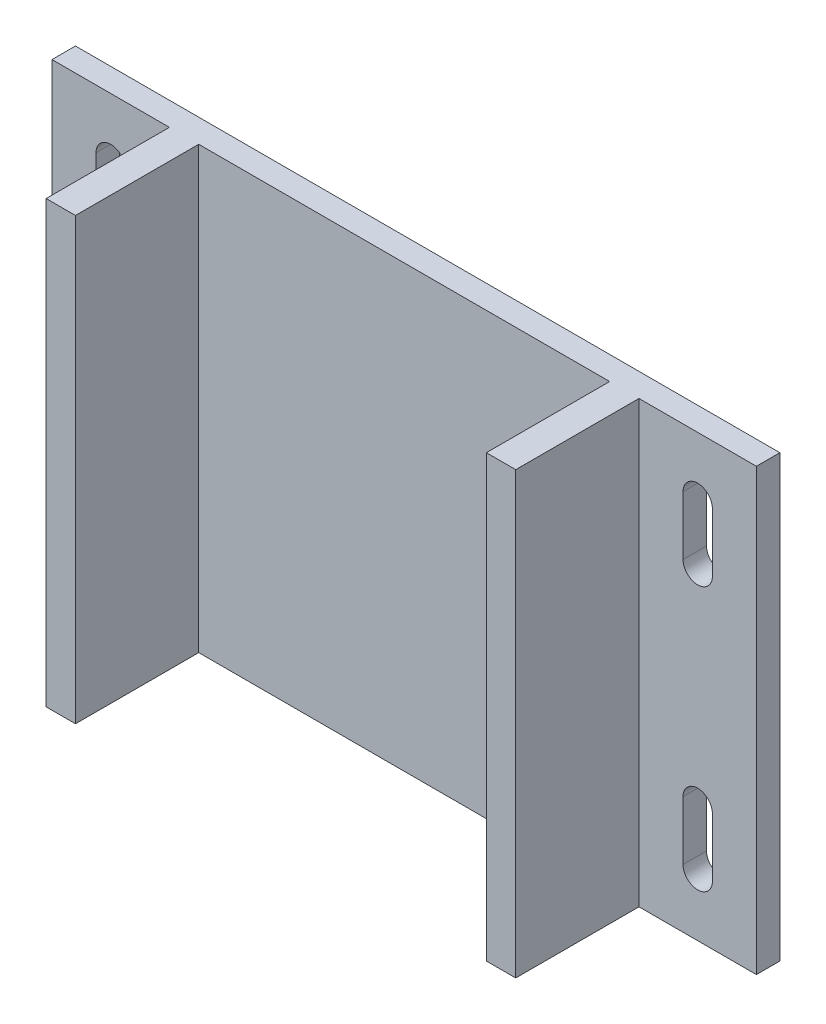
ISO-10303-21;
HEADER;
FILE_DESCRIPTION(('STEP AP214'),'2;1');
FILE_NAME('part.step','',(''),(''),'','','');
FILE_SCHEMA(('AUTOMOTIVE_DESIGN { 1 0 10303 214 1 1 1 1 }'));
ENDSEC;
DATA;
#1=APPLICATION_CONTEXT('core data for automotive mechanical design processes');
#2=APPLICATION_PROTOCOL_DEFINITION('international standard','automotive_design',2000,#1);
#3=PRODUCT_CONTEXT('',#1,'mechanical');
#4=PRODUCT('Part','Part','',(#3));
#5=PRODUCT_RELATED_PRODUCT_CATEGORY('part','',(#4));
#6=PRODUCT_DEFINITION_FORMATION('','',#4);
#7=PRODUCT_DEFINITION_CONTEXT('part definition',#1,'design');
#8=PRODUCT_DEFINITION('design','',#6,#7);
#9=PRODUCT_DEFINITION_SHAPE('','',#8);
#10=(LENGTH_UNIT() NAMED_UNIT(*) SI_UNIT(.MILLI.,.METRE.));
#11=(NAMED_UNIT(*) PLANE_ANGLE_UNIT() SI_UNIT($,.RADIAN.));
#12=(NAMED_UNIT(*) SI_UNIT($,.STERADIAN.) SOLID_ANGLE_UNIT());
#13=UNCERTAINTY_MEASURE_WITH_UNIT(LENGTH_MEASURE(1.E-05),#10,'distance_accuracy_value','');
#14=(GEOMETRIC_REPRESENTATION_CONTEXT(3) GLOBAL_UNCERTAINTY_ASSIGNED_CONTEXT((#13)) GLOBAL_UNIT_ASSIGNED_CONTEXT((#10,
#11,#12)) REPRESENTATION_CONTEXT('',''));
#15=CARTESIAN_POINT('',(0.,0.,0.));
#16=DIRECTION('',(0.,0.,1.));
#17=DIRECTION('',(1.,0.,0.));
#18=AXIS2_PLACEMENT_3D('',#15,#16,#17);
#19=CARTESIAN_POINT('',(0.,0.,4.));
#20=DIRECTION('',(0.,0.,-1.));
#21=DIRECTION('',(-1.,0.,0.));
#22=AXIS2_PLACEMENT_3D('',#19,#20,#21);
#23=PLANE('',#22);
#24=DIRECTION('',(0.,-1.,0.));
#25=VECTOR('',#24,1.);
#26=CARTESIAN_POINT('',(95.,0.,4.));
#27=LINE('',#26,#25);
#28=CARTESIAN_POINT('',(95.,75.,4.));
#29=VERTEX_POINT('',#28);
#30=CARTESIAN_POINT('',(95.,0.,4.));
#31=VERTEX_POINT('',#30);
#32=EDGE_CURVE('E356',#29,#31,#27,.T.);
#33=ORIENTED_EDGE('',*,*,#32,.F.);
#34=DIRECTION('',(-1.,0.,0.));
#35=VECTOR('',#34,1.);
#36=CARTESIAN_POINT('',(0.,75.,4.));
#37=LINE('',#36,#35);
#38=CARTESIAN_POINT('',(25.,75.,4.));
#39=VERTEX_POINT('',#38);
#40=EDGE_CURVE('E409',#29,#39,#37,.T.);
#41=ORIENTED_EDGE('',*,*,#40,.T.);
#42=DIRECTION('',(0.,1.,0.));
#43=VECTOR('',#42,1.);
#44=CARTESIAN_POINT('',(25.,0.,4.));
#45=LINE('',#44,#43);
#46=CARTESIAN_POINT('',(25.,0.,4.));
#47=VERTEX_POINT('',#46);
#48=EDGE_CURVE('E388',#47,#39,#45,.T.);
#49=ORIENTED_EDGE('',*,*,#48,.F.);
#50=DIRECTION('',(1.,0.,0.));
#51=VECTOR('',#50,1.);
#52=CARTESIAN_POINT('',(0.,0.,4.));
#53=LINE('',#52,#51);
#54=EDGE_CURVE('E426',#47,#31,#53,.T.);
#55=ORIENTED_EDGE('',*,*,#54,.T.);
#56=EDGE_LOOP('',(#33,#41,#49,#55));
#57=FACE_BOUND('',#56,.T.);
#58=ADVANCED_FACE('F35',(#57),#23,.F.);
#59=DIRECTION('',(0.,1.,0.));
#60=VECTOR('',#59,1.);
#61=CARTESIAN_POINT('',(107.5,1.49186218934005E-13,4.));
#62=LINE('',#61,#60);
#63=CARTESIAN_POINT('',(107.5,10.,4.));
#64=VERTEX_POINT('',#63);
#65=CARTESIAN_POINT('',(107.5,20.,4.));
#66=VERTEX_POINT('',#65);
#67=EDGE_CURVE('E318',#64,#66,#62,.T.);
#68=ORIENTED_EDGE('',*,*,#67,.T.);
#69=CARTESIAN_POINT('',(110.,20.,4.));
#70=DIRECTION('',(0.,0.,-1.));
#71=DIRECTION('',(-1.,0.,0.));
#72=AXIS2_PLACEMENT_3D('',#69,#70,#71);
#73=CIRCLE('',#72,2.50000000000001);
#74=CARTESIAN_POINT('',(112.5,20.,4.));
#75=VERTEX_POINT('',#74);
#76=EDGE_CURVE('E321',#66,#75,#73,.T.);
#77=ORIENTED_EDGE('',*,*,#76,.T.);
#78=DIRECTION('',(0.,-1.,0.));
#79=VECTOR('',#78,1.);
#80=CARTESIAN_POINT('',(112.5,0.,4.));
#81=LINE('',#80,#79);
#82=CARTESIAN_POINT('',(112.5,9.99999999999999,4.));
#83=VERTEX_POINT('',#82);
#84=EDGE_CURVE('E306',#75,#83,#81,.T.);
#85=ORIENTED_EDGE('',*,*,#84,.T.);
#86=CARTESIAN_POINT('',(110.,9.99999999999999,4.));
#87=DIRECTION('',(0.,0.,-1.));
#88=DIRECTION('',(-1.,0.,0.));
#89=AXIS2_PLACEMENT_3D('',#86,#87,#88);
#90=CIRCLE('',#89,2.5);
#91=EDGE_CURVE('E315',#83,#64,#90,.T.);
#92=ORIENTED_EDGE('',*,*,#91,.T.);
#93=EDGE_LOOP('',(#68,#77,#85,#92));
#94=FACE_BOUND('',#93,.T.);
#95=DIRECTION('',(0.,1.,0.));
#96=VECTOR('',#95,1.);
#97=CARTESIAN_POINT('',(107.5,-1.49186218934005E-13,4.));
#98=LINE('',#97,#96);
#99=CARTESIAN_POINT('',(107.5,55.,4.));
#100=VERTEX_POINT('',#99);
#101=CARTESIAN_POINT('',(107.5,65.,4.));
#102=VERTEX_POINT('',#101);
#103=EDGE_CURVE('E350',#100,#102,#98,.T.);
#104=ORIENTED_EDGE('',*,*,#103,.T.);
#105=CARTESIAN_POINT('',(110.,65.,4.));
#106=DIRECTION('',(0.,0.,-1.));
#107=DIRECTION('',(-1.,0.,0.));
#108=AXIS2_PLACEMENT_3D('',#105,#106,#107);
#109=CIRCLE('',#108,2.5);
#110=CARTESIAN_POINT('',(112.5,65.,4.));
#111=VERTEX_POINT('',#110);
#112=EDGE_CURVE('E353',#102,#111,#109,.T.);
#113=ORIENTED_EDGE('',*,*,#112,.T.);
#114=DIRECTION('',(0.,-1.,0.));
#115=VECTOR('',#114,1.);
#116=CARTESIAN_POINT('',(112.5,0.,4.));
#117=LINE('',#116,#115);
#118=CARTESIAN_POINT('',(112.5,55.,4.));
#119=VERTEX_POINT('',#118);
#120=EDGE_CURVE('E338',#111,#119,#117,.T.);
#121=ORIENTED_EDGE('',*,*,#120,.T.);
#122=CARTESIAN_POINT('',(110.,55.,4.));
#123=DIRECTION('',(0.,0.,-1.));
#124=DIRECTION('',(-1.,0.,0.));
#125=AXIS2_PLACEMENT_3D('',#122,#123,#124);
#126=CIRCLE('',#125,2.50000000000001);
#127=EDGE_CURVE('E347',#119,#100,#126,.T.);
#128=ORIENTED_EDGE('',*,*,#127,.T.);
#129=EDGE_LOOP('',(#104,#113,#121,#128));
#130=FACE_BOUND('',#129,.T.);
#131=DIRECTION('',(0.,1.,0.));
#132=VECTOR('',#131,1.);
#133=CARTESIAN_POINT('',(100.,0.,4.));
#134=LINE('',#133,#132);
#135=CARTESIAN_POINT('',(100.,0.,4.));
#136=VERTEX_POINT('',#135);
#137=CARTESIAN_POINT('',(100.,75.,4.));
#138=VERTEX_POINT('',#137);
#139=EDGE_CURVE('E361',#136,#138,#134,.T.);
#140=ORIENTED_EDGE('',*,*,#139,.F.);
#141=CARTESIAN_POINT('',(120.,0.,4.));
#142=VERTEX_POINT('',#141);
#143=EDGE_CURVE('E39',#136,#142,#53,.T.);
#144=ORIENTED_EDGE('',*,*,#143,.T.);
#145=DIRECTION('',(0.,1.,0.));
#146=VECTOR('',#145,1.);
#147=CARTESIAN_POINT('',(120.,0.,4.));
#148=LINE('',#147,#146);
#149=CARTESIAN_POINT('',(120.,75.,4.));
#150=VERTEX_POINT('',#149);
#151=EDGE_CURVE('E416',#142,#150,#148,.T.);
#152=ORIENTED_EDGE('',*,*,#151,.T.);
#153=EDGE_CURVE('E411',#150,#138,#37,.T.);
#154=ORIENTED_EDGE('',*,*,#153,.T.);
#155=EDGE_LOOP('',(#140,#144,#152,#154));
#156=FACE_BOUND('',#155,.T.);
#157=ADVANCED_FACE('F508',(#94,#130,#156),#23,.F.);
#158=DIRECTION('',(0.,-1.,0.));
#159=VECTOR('',#158,1.);
#160=CARTESIAN_POINT('',(12.5000000000001,0.,4.));
#161=LINE('',#160,#159);
#162=CARTESIAN_POINT('',(12.5,65.,4.));
#163=VERTEX_POINT('',#162);
#164=CARTESIAN_POINT('',(12.5,55.,4.));
#165=VERTEX_POINT('',#164);
#166=EDGE_CURVE('E254',#163,#165,#161,.T.);
#167=ORIENTED_EDGE('',*,*,#166,.T.);
#168=CARTESIAN_POINT('',(10.,55.,4.));
#169=DIRECTION('',(0.,0.,-1.));
#170=DIRECTION('',(-1.,0.,0.));
#171=AXIS2_PLACEMENT_3D('',#168,#169,#170);
#172=CIRCLE('',#171,2.50000000000001);
#173=CARTESIAN_POINT('',(7.50000000000002,55.,4.));
#174=VERTEX_POINT('',#173);
#175=EDGE_CURVE('E257',#165,#174,#172,.T.);
#176=ORIENTED_EDGE('',*,*,#175,.T.);
#177=DIRECTION('',(0.,1.,0.));
#178=VECTOR('',#177,1.);
#179=CARTESIAN_POINT('',(7.50000000000002,0.,4.));
#180=LINE('',#179,#178);
#181=CARTESIAN_POINT('',(7.50000000000002,65.,4.));
#182=VERTEX_POINT('',#181);
#183=EDGE_CURVE('E249',#174,#182,#180,.T.);
#184=ORIENTED_EDGE('',*,*,#183,.T.);
#185=CARTESIAN_POINT('',(10.,65.,4.));
#186=DIRECTION('',(0.,0.,-1.));
#187=DIRECTION('',(-1.,0.,0.));
#188=AXIS2_PLACEMENT_3D('',#185,#186,#187);
#189=CIRCLE('',#188,2.5);
#190=EDGE_CURVE('E229',#182,#163,#189,.T.);
#191=ORIENTED_EDGE('',*,*,#190,.T.);
#192=EDGE_LOOP('',(#167,#176,#184,#191));
#193=FACE_BOUND('',#192,.T.);
#194=DIRECTION('',(0.,-1.,0.));
#195=VECTOR('',#194,1.);
#196=CARTESIAN_POINT('',(12.5,0.,4.));
#197=LINE('',#196,#195);
#198=CARTESIAN_POINT('',(12.5,20.,4.));
#199=VERTEX_POINT('',#198);
#200=CARTESIAN_POINT('',(12.5,10.,4.));
#201=VERTEX_POINT('',#200);
#202=EDGE_CURVE('E286',#199,#201,#197,.T.);
#203=ORIENTED_EDGE('',*,*,#202,.T.);
#204=CARTESIAN_POINT('',(10.,9.99999999999999,4.));
#205=DIRECTION('',(0.,0.,-1.));
#206=DIRECTION('',(-1.,0.,0.));
#207=AXIS2_PLACEMENT_3D('',#204,#205,#206);
#208=CIRCLE('',#207,2.5);
#209=CARTESIAN_POINT('',(7.50000000000001,9.99999999999999,4.));
#210=VERTEX_POINT('',#209);
#211=EDGE_CURVE('E289',#201,#210,#208,.T.);
#212=ORIENTED_EDGE('',*,*,#211,.T.);
#213=DIRECTION('',(0.,1.,0.));
#214=VECTOR('',#213,1.);
#215=CARTESIAN_POINT('',(7.50000000000001,0.,4.));
#216=LINE('',#215,#214);
#217=CARTESIAN_POINT('',(7.50000000000001,20.,4.));
#218=VERTEX_POINT('',#217);
#219=EDGE_CURVE('E274',#210,#218,#216,.T.);
#220=ORIENTED_EDGE('',*,*,#219,.T.);
#221=CARTESIAN_POINT('',(10.,20.,4.));
#222=DIRECTION('',(0.,0.,-1.));
#223=DIRECTION('',(-1.,0.,0.));
#224=AXIS2_PLACEMENT_3D('',#221,#222,#223);
#225=CIRCLE('',#224,2.50000000000001);
#226=EDGE_CURVE('E283',#218,#199,#225,.T.);
#227=ORIENTED_EDGE('',*,*,#226,.T.);
#228=EDGE_LOOP('',(#203,#212,#220,#227));
#229=FACE_BOUND('',#228,.T.);
#230=DIRECTION('',(0.,-1.,0.));
#231=VECTOR('',#230,1.);
#232=CARTESIAN_POINT('',(20.,0.,4.));
#233=LINE('',#232,#231);
#234=CARTESIAN_POINT('',(20.,75.,4.));
#235=VERTEX_POINT('',#234);
#236=CARTESIAN_POINT('',(20.,0.,4.));
#237=VERTEX_POINT('',#236);
#238=EDGE_CURVE('E383',#235,#237,#233,.T.);
#239=ORIENTED_EDGE('',*,*,#238,.F.);
#240=CARTESIAN_POINT('',(0.,75.,4.));
#241=VERTEX_POINT('',#240);
#242=EDGE_CURVE('E412',#235,#241,#37,.T.);
#243=ORIENTED_EDGE('',*,*,#242,.T.);
#244=DIRECTION('',(0.,-1.,0.));
#245=VECTOR('',#244,1.);
#246=CARTESIAN_POINT('',(0.,0.,4.));
#247=LINE('',#246,#245);
#248=CARTESIAN_POINT('',(0.,0.,4.));
#249=VERTEX_POINT('',#248);
#250=EDGE_CURVE('E430',#241,#249,#247,.T.);
#251=ORIENTED_EDGE('',*,*,#250,.T.);
#252=EDGE_CURVE('E428',#249,#237,#53,.T.);
#253=ORIENTED_EDGE('',*,*,#252,.T.);
#254=EDGE_LOOP('',(#239,#243,#251,#253));
#255=FACE_BOUND('',#254,.T.);
#256=ADVANCED_FACE('F509',(#193,#229,#255),#23,.F.);
#257=CARTESIAN_POINT('',(0.,0.,4.));
#258=DIRECTION('',(1.,0.,0.));
#259=DIRECTION('',(0.,0.,-1.));
#260=AXIS2_PLACEMENT_3D('',#257,#258,#259);
#261=PLANE('',#260);
#262=DIRECTION('',(0.,-1.,0.));
#263=VECTOR('',#262,1.);
#264=CARTESIAN_POINT('',(0.,0.,0.));
#265=LINE('',#264,#263);
#266=CARTESIAN_POINT('',(0.,75.,0.));
#267=VERTEX_POINT('',#266);
#268=CARTESIAN_POINT('',(0.,0.,0.));
#269=VERTEX_POINT('',#268);
#270=EDGE_CURVE('E417',#267,#269,#265,.T.);
#271=ORIENTED_EDGE('',*,*,#270,.T.);
#272=DIRECTION('',(0.,0.,-1.));
#273=VECTOR('',#272,1.);
#274=CARTESIAN_POINT('',(0.,0.,4.));
#275=LINE('',#274,#273);
#276=EDGE_CURVE('E11',#249,#269,#275,.T.);
#277=ORIENTED_EDGE('',*,*,#276,.F.);
#278=ORIENTED_EDGE('',*,*,#250,.F.);
#279=DIRECTION('',(0.,0.,-1.));
#280=VECTOR('',#279,1.);
#281=CARTESIAN_POINT('',(0.,75.,4.));
#282=LINE('',#281,#280);
#283=EDGE_CURVE('E425',#241,#267,#282,.T.);
#284=ORIENTED_EDGE('',*,*,#283,.T.);
#285=EDGE_LOOP('',(#271,#277,#278,#284));
#286=FACE_BOUND('',#285,.T.);
#287=ADVANCED_FACE('F37',(#286),#261,.F.);
#288=CARTESIAN_POINT('',(0.,0.,4.));
#289=DIRECTION('',(0.,1.,0.));
#290=DIRECTION('',(0.,0.,1.));
#291=AXIS2_PLACEMENT_3D('',#288,#289,#290);
#292=PLANE('',#291);
#293=DIRECTION('',(1.,0.,0.));
#294=VECTOR('',#293,1.);
#295=CARTESIAN_POINT('',(0.,0.,0.));
#296=LINE('',#295,#294);
#297=CARTESIAN_POINT('',(120.,0.,0.));
#298=VERTEX_POINT('',#297);
#299=EDGE_CURVE('E445',#269,#298,#296,.T.);
#300=ORIENTED_EDGE('',*,*,#299,.T.);
#301=DIRECTION('',(0.,0.,-1.));
#302=VECTOR('',#301,1.);
#303=CARTESIAN_POINT('',(120.,0.,4.));
#304=LINE('',#303,#302);
#305=EDGE_CURVE('E45',#142,#298,#304,.T.);
#306=ORIENTED_EDGE('',*,*,#305,.F.);
#307=ORIENTED_EDGE('',*,*,#143,.F.);
#308=DIRECTION('',(0.,0.,-1.));
#309=VECTOR('',#308,1.);
#310=CARTESIAN_POINT('',(100.,0.,25.));
#311=LINE('',#310,#309);
#312=CARTESIAN_POINT('',(100.,0.,25.));
#313=VERTEX_POINT('',#312);
#314=EDGE_CURVE('E377',#313,#136,#311,.T.);
#315=ORIENTED_EDGE('',*,*,#314,.F.);
#316=DIRECTION('',(1.,0.,0.));
#317=VECTOR('',#316,1.);
#318=CARTESIAN_POINT('',(95.,0.,25.));
#319=LINE('',#318,#317);
#320=CARTESIAN_POINT('',(95.,0.,25.));
#321=VERTEX_POINT('',#320);
#322=EDGE_CURVE('E360',#321,#313,#319,.T.);
#323=ORIENTED_EDGE('',*,*,#322,.F.);
#324=DIRECTION('',(0.,0.,-1.));
#325=VECTOR('',#324,1.);
#326=CARTESIAN_POINT('',(95.,0.,25.));
#327=LINE('',#326,#325);
#328=EDGE_CURVE('E380',#321,#31,#327,.T.);
#329=ORIENTED_EDGE('',*,*,#328,.T.);
#330=ORIENTED_EDGE('',*,*,#54,.F.);
#331=DIRECTION('',(0.,0.,-1.));
#332=VECTOR('',#331,1.);
#333=CARTESIAN_POINT('',(25.,0.,25.));
#334=LINE('',#333,#332);
#335=CARTESIAN_POINT('',(25.,0.,25.));
#336=VERTEX_POINT('',#335);
#337=EDGE_CURVE('E466',#336,#47,#334,.T.);
#338=ORIENTED_EDGE('',*,*,#337,.F.);
#339=DIRECTION('',(1.,0.,0.));
#340=VECTOR('',#339,1.);
#341=CARTESIAN_POINT('',(20.,0.,25.));
#342=LINE('',#341,#340);
#343=CARTESIAN_POINT('',(20.,0.,25.));
#344=VERTEX_POINT('',#343);
#345=EDGE_CURVE('E387',#344,#336,#342,.T.);
#346=ORIENTED_EDGE('',*,*,#345,.F.);
#347=DIRECTION('',(0.,0.,-1.));
#348=VECTOR('',#347,1.);
#349=CARTESIAN_POINT('',(20.,0.,25.));
#350=LINE('',#349,#348);
#351=EDGE_CURVE('E464',#344,#237,#350,.T.);
#352=ORIENTED_EDGE('',*,*,#351,.T.);
#353=ORIENTED_EDGE('',*,*,#252,.F.);
#354=ORIENTED_EDGE('',*,*,#276,.T.);
#355=EDGE_LOOP('',(#300,#306,#307,#315,#323,#329,#330,#338,#346,#352,#353,#354));
#356=FACE_BOUND('',#355,.T.);
#357=ADVANCED_FACE('F493',(#356),#292,.F.);
#358=CARTESIAN_POINT('',(120.,0.,4.));
#359=DIRECTION('',(-1.,0.,0.));
#360=DIRECTION('',(0.,0.,1.));
#361=AXIS2_PLACEMENT_3D('',#358,#359,#360);
#362=PLANE('',#361);
#363=DIRECTION('',(0.,1.,0.));
#364=VECTOR('',#363,1.);
#365=CARTESIAN_POINT('',(120.,0.,0.));
#366=LINE('',#365,#364);
#367=CARTESIAN_POINT('',(120.,75.,0.));
#368=VERTEX_POINT('',#367);
#369=EDGE_CURVE('E438',#298,#368,#366,.T.);
#370=ORIENTED_EDGE('',*,*,#369,.T.);
#371=DIRECTION('',(0.,0.,-1.));
#372=VECTOR('',#371,1.);
#373=CARTESIAN_POINT('',(120.,75.,4.));
#374=LINE('',#373,#372);
#375=EDGE_CURVE('E449',#150,#368,#374,.T.);
#376=ORIENTED_EDGE('',*,*,#375,.F.);
#377=ORIENTED_EDGE('',*,*,#151,.F.);
#378=ORIENTED_EDGE('',*,*,#305,.T.);
#379=EDGE_LOOP('',(#370,#376,#377,#378));
#380=FACE_BOUND('',#379,.T.);
#381=ADVANCED_FACE('F456',(#380),#362,.F.);
#382=CARTESIAN_POINT('',(0.,75.,4.));
#383=DIRECTION('',(0.,-1.,0.));
#384=DIRECTION('',(0.,0.,-1.));
#385=AXIS2_PLACEMENT_3D('',#382,#383,#384);
#386=PLANE('',#385);
#387=DIRECTION('',(-1.,0.,0.));
#388=VECTOR('',#387,1.);
#389=CARTESIAN_POINT('',(0.,75.,0.));
#390=LINE('',#389,#388);
#391=EDGE_CURVE('E434',#368,#267,#390,.T.);
#392=ORIENTED_EDGE('',*,*,#391,.T.);
#393=ORIENTED_EDGE('',*,*,#283,.F.);
#394=ORIENTED_EDGE('',*,*,#242,.F.);
#395=DIRECTION('',(0.,0.,-1.));
#396=VECTOR('',#395,1.);
#397=CARTESIAN_POINT('',(20.,75.,25.));
#398=LINE('',#397,#396);
#399=CARTESIAN_POINT('',(20.,75.,25.));
#400=VERTEX_POINT('',#399);
#401=EDGE_CURVE('E394',#400,#235,#398,.T.);
#402=ORIENTED_EDGE('',*,*,#401,.F.);
#403=DIRECTION('',(-1.,0.,0.));
#404=VECTOR('',#403,1.);
#405=CARTESIAN_POINT('',(20.,75.,25.));
#406=LINE('',#405,#404);
#407=CARTESIAN_POINT('',(25.,75.,25.));
#408=VERTEX_POINT('',#407);
#409=EDGE_CURVE('E392',#408,#400,#406,.T.);
#410=ORIENTED_EDGE('',*,*,#409,.F.);
#411=DIRECTION('',(0.,0.,-1.));
#412=VECTOR('',#411,1.);
#413=CARTESIAN_POINT('',(25.,75.,25.));
#414=LINE('',#413,#412);
#415=EDGE_CURVE('E407',#408,#39,#414,.T.);
#416=ORIENTED_EDGE('',*,*,#415,.T.);
#417=ORIENTED_EDGE('',*,*,#40,.F.);
#418=DIRECTION('',(0.,0.,-1.));
#419=VECTOR('',#418,1.);
#420=CARTESIAN_POINT('',(95.,75.,25.));
#421=LINE('',#420,#419);
#422=CARTESIAN_POINT('',(95.,75.,25.));
#423=VERTEX_POINT('',#422);
#424=EDGE_CURVE('E367',#423,#29,#421,.T.);
#425=ORIENTED_EDGE('',*,*,#424,.F.);
#426=DIRECTION('',(-1.,0.,0.));
#427=VECTOR('',#426,1.);
#428=CARTESIAN_POINT('',(95.,75.,25.));
#429=LINE('',#428,#427);
#430=CARTESIAN_POINT('',(100.,75.,25.));
#431=VERTEX_POINT('',#430);
#432=EDGE_CURVE('E365',#431,#423,#429,.T.);
#433=ORIENTED_EDGE('',*,*,#432,.F.);
#434=DIRECTION('',(0.,0.,-1.));
#435=VECTOR('',#434,1.);
#436=CARTESIAN_POINT('',(100.,75.,25.));
#437=LINE('',#436,#435);
#438=EDGE_CURVE('E374',#431,#138,#437,.T.);
#439=ORIENTED_EDGE('',*,*,#438,.T.);
#440=ORIENTED_EDGE('',*,*,#153,.F.);
#441=ORIENTED_EDGE('',*,*,#375,.T.);
#442=EDGE_LOOP('',(#392,#393,#394,#402,#410,#416,#417,#425,#433,#439,#440,#441));
#443=FACE_BOUND('',#442,.T.);
#444=ADVANCED_FACE('F485',(#443),#386,.F.);
#445=CARTESIAN_POINT('',(0.,0.,0.));
#446=DIRECTION('',(0.,0.,-1.));
#447=DIRECTION('',(-1.,0.,0.));
#448=AXIS2_PLACEMENT_3D('',#445,#446,#447);
#449=PLANE('',#448);
#450=CARTESIAN_POINT('',(10.,55.,0.));
#451=DIRECTION('',(0.,0.,-1.));
#452=DIRECTION('',(1.,0.,0.));
#453=AXIS2_PLACEMENT_3D('',#450,#451,#452);
#454=CIRCLE('',#453,2.50000000000001);
#455=CARTESIAN_POINT('',(12.5,55.,0.));
#456=VERTEX_POINT('',#455);
#457=CARTESIAN_POINT('',(7.50000000000002,55.,0.));
#458=VERTEX_POINT('',#457);
#459=EDGE_CURVE('E61',#456,#458,#454,.T.);
#460=ORIENTED_EDGE('',*,*,#459,.F.);
#461=DIRECTION('',(0.,-1.,0.));
#462=VECTOR('',#461,1.);
#463=CARTESIAN_POINT('',(12.5,65.,0.));
#464=LINE('',#463,#462);
#465=CARTESIAN_POINT('',(12.5,65.,0.));
#466=VERTEX_POINT('',#465);
#467=EDGE_CURVE('E242',#466,#456,#464,.T.);
#468=ORIENTED_EDGE('',*,*,#467,.F.);
#469=CARTESIAN_POINT('',(10.,65.,0.));
#470=DIRECTION('',(0.,0.,-1.));
#471=DIRECTION('',(1.,0.,0.));
#472=AXIS2_PLACEMENT_3D('',#469,#470,#471);
#473=CIRCLE('',#472,2.5);
#474=CARTESIAN_POINT('',(7.50000000000002,65.,0.));
#475=VERTEX_POINT('',#474);
#476=EDGE_CURVE('E226',#475,#466,#473,.T.);
#477=ORIENTED_EDGE('',*,*,#476,.F.);
#478=DIRECTION('',(0.,1.,0.));
#479=VECTOR('',#478,1.);
#480=CARTESIAN_POINT('',(7.50000000000002,65.,0.));
#481=LINE('',#480,#479);
#482=EDGE_CURVE('E235',#458,#475,#481,.T.);
#483=ORIENTED_EDGE('',*,*,#482,.F.);
#484=EDGE_LOOP('',(#460,#468,#477,#483));
#485=FACE_BOUND('',#484,.T.);
#486=CARTESIAN_POINT('',(10.,9.99999999999999,0.));
#487=DIRECTION('',(0.,0.,-1.));
#488=DIRECTION('',(-1.,0.,0.));
#489=AXIS2_PLACEMENT_3D('',#486,#487,#488);
#490=CIRCLE('',#489,2.5);
#491=CARTESIAN_POINT('',(12.5,10.,0.));
#492=VERTEX_POINT('',#491);
#493=CARTESIAN_POINT('',(7.50000000000001,9.99999999999999,0.));
#494=VERTEX_POINT('',#493);
#495=EDGE_CURVE('E260',#492,#494,#490,.T.);
#496=ORIENTED_EDGE('',*,*,#495,.F.);
#497=DIRECTION('',(0.,-1.,0.));
#498=VECTOR('',#497,1.);
#499=CARTESIAN_POINT('',(12.5,10.,0.));
#500=LINE('',#499,#498);
#501=CARTESIAN_POINT('',(12.5,20.,0.));
#502=VERTEX_POINT('',#501);
#503=EDGE_CURVE('E268',#502,#492,#500,.T.);
#504=ORIENTED_EDGE('',*,*,#503,.F.);
#505=CARTESIAN_POINT('',(10.,20.,0.));
#506=DIRECTION('',(0.,0.,-1.));
#507=DIRECTION('',(-1.,0.,0.));
#508=AXIS2_PLACEMENT_3D('',#505,#506,#507);
#509=CIRCLE('',#508,2.50000000000001);
#510=CARTESIAN_POINT('',(7.50000000000001,20.,0.));
#511=VERTEX_POINT('',#510);
#512=EDGE_CURVE('E265',#511,#502,#509,.T.);
#513=ORIENTED_EDGE('',*,*,#512,.F.);
#514=DIRECTION('',(0.,1.,0.));
#515=VECTOR('',#514,1.);
#516=CARTESIAN_POINT('',(7.50000000000001,9.99999999999999,0.));
#517=LINE('',#516,#515);
#518=EDGE_CURVE('E262',#494,#511,#517,.T.);
#519=ORIENTED_EDGE('',*,*,#518,.F.);
#520=EDGE_LOOP('',(#496,#504,#513,#519));
#521=FACE_BOUND('',#520,.T.);
#522=CARTESIAN_POINT('',(110.,20.,0.));
#523=DIRECTION('',(0.,0.,-1.));
#524=DIRECTION('',(1.,0.,0.));
#525=AXIS2_PLACEMENT_3D('',#522,#523,#524);
#526=CIRCLE('',#525,2.50000000000001);
#527=CARTESIAN_POINT('',(107.5,20.,0.));
#528=VERTEX_POINT('',#527);
#529=CARTESIAN_POINT('',(112.5,20.,0.));
#530=VERTEX_POINT('',#529);
#531=EDGE_CURVE('E292',#528,#530,#526,.T.);
#532=ORIENTED_EDGE('',*,*,#531,.F.);
#533=DIRECTION('',(0.,1.,0.));
#534=VECTOR('',#533,1.);
#535=CARTESIAN_POINT('',(107.5,10.,0.));
#536=LINE('',#535,#534);
#537=CARTESIAN_POINT('',(107.5,10.,0.));
#538=VERTEX_POINT('',#537);
#539=EDGE_CURVE('E300',#538,#528,#536,.T.);
#540=ORIENTED_EDGE('',*,*,#539,.F.);
#541=CARTESIAN_POINT('',(110.,9.99999999999999,0.));
#542=DIRECTION('',(0.,0.,-1.));
#543=DIRECTION('',(1.,0.,0.));
#544=AXIS2_PLACEMENT_3D('',#541,#542,#543);
#545=CIRCLE('',#544,2.5);
#546=CARTESIAN_POINT('',(112.5,9.99999999999999,0.));
#547=VERTEX_POINT('',#546);
#548=EDGE_CURVE('E297',#547,#538,#545,.T.);
#549=ORIENTED_EDGE('',*,*,#548,.F.);
#550=DIRECTION('',(0.,-1.,0.));
#551=VECTOR('',#550,1.);
#552=CARTESIAN_POINT('',(112.5,9.99999999999999,0.));
#553=LINE('',#552,#551);
#554=EDGE_CURVE('E294',#530,#547,#553,.T.);
#555=ORIENTED_EDGE('',*,*,#554,.F.);
#556=EDGE_LOOP('',(#532,#540,#549,#555));
#557=FACE_BOUND('',#556,.T.);
#558=CARTESIAN_POINT('',(110.,65.,0.));
#559=DIRECTION('',(0.,0.,-1.));
#560=DIRECTION('',(-1.,0.,0.));
#561=AXIS2_PLACEMENT_3D('',#558,#559,#560);
#562=CIRCLE('',#561,2.5);
#563=CARTESIAN_POINT('',(107.5,65.,0.));
#564=VERTEX_POINT('',#563);
#565=CARTESIAN_POINT('',(112.5,65.,0.));
#566=VERTEX_POINT('',#565);
#567=EDGE_CURVE('E324',#564,#566,#562,.T.);
#568=ORIENTED_EDGE('',*,*,#567,.F.);
#569=DIRECTION('',(0.,1.,0.));
#570=VECTOR('',#569,1.);
#571=CARTESIAN_POINT('',(107.5,65.,0.));
#572=LINE('',#571,#570);
#573=CARTESIAN_POINT('',(107.5,55.,0.));
#574=VERTEX_POINT('',#573);
#575=EDGE_CURVE('E332',#574,#564,#572,.T.);
#576=ORIENTED_EDGE('',*,*,#575,.F.);
#577=CARTESIAN_POINT('',(110.,55.,0.));
#578=DIRECTION('',(0.,0.,-1.));
#579=DIRECTION('',(-1.,0.,0.));
#580=AXIS2_PLACEMENT_3D('',#577,#578,#579);
#581=CIRCLE('',#580,2.50000000000001);
#582=CARTESIAN_POINT('',(112.5,55.,0.));
#583=VERTEX_POINT('',#582);
#584=EDGE_CURVE('E329',#583,#574,#581,.T.);
#585=ORIENTED_EDGE('',*,*,#584,.F.);
#586=DIRECTION('',(0.,-1.,0.));
#587=VECTOR('',#586,1.);
#588=CARTESIAN_POINT('',(112.5,65.,0.));
#589=LINE('',#588,#587);
#590=EDGE_CURVE('E326',#566,#583,#589,.T.);
#591=ORIENTED_EDGE('',*,*,#590,.F.);
#592=EDGE_LOOP('',(#568,#576,#585,#591));
#593=FACE_BOUND('',#592,.T.);
#594=ORIENTED_EDGE('',*,*,#270,.F.);
#595=ORIENTED_EDGE('',*,*,#391,.F.);
#596=ORIENTED_EDGE('',*,*,#369,.F.);
#597=ORIENTED_EDGE('',*,*,#299,.F.);
#598=EDGE_LOOP('',(#594,#595,#596,#597));
#599=FACE_BOUND('',#598,.T.);
#600=ADVANCED_FACE('F239',(#485,#521,#557,#593,#599),#449,.T.);
#601=CARTESIAN_POINT('',(20.,0.,25.));
#602=DIRECTION('',(1.,0.,0.));
#603=DIRECTION('',(0.,0.,-1.));
#604=AXIS2_PLACEMENT_3D('',#601,#602,#603);
#605=PLANE('',#604);
#606=ORIENTED_EDGE('',*,*,#238,.T.);
#607=ORIENTED_EDGE('',*,*,#351,.F.);
#608=DIRECTION('',(0.,-1.,0.));
#609=VECTOR('',#608,1.);
#610=CARTESIAN_POINT('',(20.,0.,25.));
#611=LINE('',#610,#609);
#612=EDGE_CURVE('E384',#400,#344,#611,.T.);
#613=ORIENTED_EDGE('',*,*,#612,.F.);
#614=ORIENTED_EDGE('',*,*,#401,.T.);
#615=EDGE_LOOP('',(#606,#607,#613,#614));
#616=FACE_BOUND('',#615,.T.);
#617=ADVANCED_FACE('F511',(#616),#605,.F.);
#618=CARTESIAN_POINT('',(25.,0.,25.));
#619=DIRECTION('',(-1.,0.,0.));
#620=DIRECTION('',(0.,0.,1.));
#621=AXIS2_PLACEMENT_3D('',#618,#619,#620);
#622=PLANE('',#621);
#623=ORIENTED_EDGE('',*,*,#48,.T.);
#624=ORIENTED_EDGE('',*,*,#415,.F.);
#625=DIRECTION('',(0.,1.,0.));
#626=VECTOR('',#625,1.);
#627=CARTESIAN_POINT('',(25.,0.,25.));
#628=LINE('',#627,#626);
#629=EDGE_CURVE('E390',#336,#408,#628,.T.);
#630=ORIENTED_EDGE('',*,*,#629,.F.);
#631=ORIENTED_EDGE('',*,*,#337,.T.);
#632=EDGE_LOOP('',(#623,#624,#630,#631));
#633=FACE_BOUND('',#632,.T.);
#634=ADVANCED_FACE('F479',(#633),#622,.F.);
#635=CARTESIAN_POINT('',(0.,0.,25.));
#636=DIRECTION('',(0.,0.,-1.));
#637=DIRECTION('',(-1.,0.,0.));
#638=AXIS2_PLACEMENT_3D('',#635,#636,#637);
#639=PLANE('',#638);
#640=ORIENTED_EDGE('',*,*,#612,.T.);
#641=ORIENTED_EDGE('',*,*,#345,.T.);
#642=ORIENTED_EDGE('',*,*,#629,.T.);
#643=ORIENTED_EDGE('',*,*,#409,.T.);
#644=EDGE_LOOP('',(#640,#641,#642,#643));
#645=FACE_BOUND('',#644,.T.);
#646=ADVANCED_FACE('F492',(#645),#639,.F.);
#647=CARTESIAN_POINT('',(95.,0.,25.));
#648=DIRECTION('',(1.,0.,0.));
#649=DIRECTION('',(0.,0.,-1.));
#650=AXIS2_PLACEMENT_3D('',#647,#648,#649);
#651=PLANE('',#650);
#652=ORIENTED_EDGE('',*,*,#32,.T.);
#653=ORIENTED_EDGE('',*,*,#328,.F.);
#654=DIRECTION('',(0.,-1.,0.));
#655=VECTOR('',#654,1.);
#656=CARTESIAN_POINT('',(95.,0.,25.));
#657=LINE('',#656,#655);
#658=EDGE_CURVE('E357',#423,#321,#657,.T.);
#659=ORIENTED_EDGE('',*,*,#658,.F.);
#660=ORIENTED_EDGE('',*,*,#424,.T.);
#661=EDGE_LOOP('',(#652,#653,#659,#660));
#662=FACE_BOUND('',#661,.T.);
#663=ADVANCED_FACE('F497',(#662),#651,.F.);
#664=CARTESIAN_POINT('',(100.,0.,25.));
#665=DIRECTION('',(-1.,0.,0.));
#666=DIRECTION('',(0.,0.,1.));
#667=AXIS2_PLACEMENT_3D('',#664,#665,#666);
#668=PLANE('',#667);
#669=ORIENTED_EDGE('',*,*,#139,.T.);
#670=ORIENTED_EDGE('',*,*,#438,.F.);
#671=DIRECTION('',(0.,1.,0.));
#672=VECTOR('',#671,1.);
#673=CARTESIAN_POINT('',(100.,0.,25.));
#674=LINE('',#673,#672);
#675=EDGE_CURVE('E363',#313,#431,#674,.T.);
#676=ORIENTED_EDGE('',*,*,#675,.F.);
#677=ORIENTED_EDGE('',*,*,#314,.T.);
#678=EDGE_LOOP('',(#669,#670,#676,#677));
#679=FACE_BOUND('',#678,.T.);
#680=ADVANCED_FACE('F506',(#679),#668,.F.);
#681=CARTESIAN_POINT('',(0.,0.,25.));
#682=DIRECTION('',(0.,0.,-1.));
#683=DIRECTION('',(-1.,0.,0.));
#684=AXIS2_PLACEMENT_3D('',#681,#682,#683);
#685=PLANE('',#684);
#686=ORIENTED_EDGE('',*,*,#658,.T.);
#687=ORIENTED_EDGE('',*,*,#322,.T.);
#688=ORIENTED_EDGE('',*,*,#675,.T.);
#689=ORIENTED_EDGE('',*,*,#432,.T.);
#690=EDGE_LOOP('',(#686,#687,#688,#689));
#691=FACE_BOUND('',#690,.T.);
#692=ADVANCED_FACE('F502',(#691),#685,.F.);
#693=CARTESIAN_POINT('',(110.,65.,25.000025));
#694=DIRECTION('',(0.,0.,-1.));
#695=DIRECTION('',(-1.,0.,0.));
#696=AXIS2_PLACEMENT_3D('',#693,#694,#695);
#697=CYLINDRICAL_SURFACE('',#696,2.5);
#698=DIRECTION('',(0.,0.,-1.));
#699=VECTOR('',#698,1.);
#700=CARTESIAN_POINT('',(107.5,65.,25.000025));
#701=LINE('',#700,#699);
#702=EDGE_CURVE('E336',#102,#564,#701,.T.);
#703=ORIENTED_EDGE('',*,*,#702,.T.);
#704=ORIENTED_EDGE('',*,*,#567,.T.);
#705=DIRECTION('',(0.,0.,-1.));
#706=VECTOR('',#705,1.);
#707=CARTESIAN_POINT('',(112.5,65.,25.000025));
#708=LINE('',#707,#706);
#709=EDGE_CURVE('E335',#111,#566,#708,.T.);
#710=ORIENTED_EDGE('',*,*,#709,.F.);
#711=ORIENTED_EDGE('',*,*,#112,.F.);
#712=EDGE_LOOP('',(#703,#704,#710,#711));
#713=FACE_BOUND('',#712,.T.);
#714=ADVANCED_FACE('F584',(#713),#697,.F.);
#715=CARTESIAN_POINT('',(107.5,65.,25.000025));
#716=DIRECTION('',(-1.,0.,0.));
#717=DIRECTION('',(0.,-1.,0.));
#718=AXIS2_PLACEMENT_3D('',#715,#716,#717);
#719=PLANE('',#718);
#720=DIRECTION('',(0.,0.,-1.));
#721=VECTOR('',#720,1.);
#722=CARTESIAN_POINT('',(107.5,55.,25.000025));
#723=LINE('',#722,#721);
#724=EDGE_CURVE('E339',#100,#574,#723,.T.);
#725=ORIENTED_EDGE('',*,*,#724,.T.);
#726=ORIENTED_EDGE('',*,*,#575,.T.);
#727=ORIENTED_EDGE('',*,*,#702,.F.);
#728=ORIENTED_EDGE('',*,*,#103,.F.);
#729=EDGE_LOOP('',(#725,#726,#727,#728));
#730=FACE_BOUND('',#729,.T.);
#731=ADVANCED_FACE('F580',(#730),#719,.F.);
#732=CARTESIAN_POINT('',(110.,55.,25.000025));
#733=DIRECTION('',(0.,0.,-1.));
#734=DIRECTION('',(-1.,0.,0.));
#735=AXIS2_PLACEMENT_3D('',#732,#733,#734);
#736=CYLINDRICAL_SURFACE('',#735,2.50000000000001);
#737=DIRECTION('',(0.,0.,-1.));
#738=VECTOR('',#737,1.);
#739=CARTESIAN_POINT('',(112.5,55.,25.000025));
#740=LINE('',#739,#738);
#741=EDGE_CURVE('E341',#119,#583,#740,.T.);
#742=ORIENTED_EDGE('',*,*,#741,.T.);
#743=ORIENTED_EDGE('',*,*,#584,.T.);
#744=ORIENTED_EDGE('',*,*,#724,.F.);
#745=ORIENTED_EDGE('',*,*,#127,.F.);
#746=EDGE_LOOP('',(#742,#743,#744,#745));
#747=FACE_BOUND('',#746,.T.);
#748=ADVANCED_FACE('F583',(#747),#736,.F.);
#749=CARTESIAN_POINT('',(112.5,65.,25.000025));
#750=DIRECTION('',(1.,0.,0.));
#751=DIRECTION('',(0.,0.,-1.));
#752=AXIS2_PLACEMENT_3D('',#749,#750,#751);
#753=PLANE('',#752);
#754=ORIENTED_EDGE('',*,*,#709,.T.);
#755=ORIENTED_EDGE('',*,*,#590,.T.);
#756=ORIENTED_EDGE('',*,*,#741,.F.);
#757=ORIENTED_EDGE('',*,*,#120,.F.);
#758=EDGE_LOOP('',(#754,#755,#756,#757));
#759=FACE_BOUND('',#758,.T.);
#760=ADVANCED_FACE('F578',(#759),#753,.F.);
#761=CARTESIAN_POINT('',(110.,20.,25.000025));
#762=DIRECTION('',(0.,0.,-1.));
#763=DIRECTION('',(-1.,0.,0.));
#764=AXIS2_PLACEMENT_3D('',#761,#762,#763);
#765=CYLINDRICAL_SURFACE('',#764,2.50000000000001);
#766=DIRECTION('',(0.,0.,-1.));
#767=VECTOR('',#766,1.);
#768=CARTESIAN_POINT('',(107.5,20.,25.000025));
#769=LINE('',#768,#767);
#770=EDGE_CURVE('E304',#66,#528,#769,.T.);
#771=ORIENTED_EDGE('',*,*,#770,.T.);
#772=ORIENTED_EDGE('',*,*,#531,.T.);
#773=DIRECTION('',(0.,0.,-1.));
#774=VECTOR('',#773,1.);
#775=CARTESIAN_POINT('',(112.5,20.,25.000025));
#776=LINE('',#775,#774);
#777=EDGE_CURVE('E303',#75,#530,#776,.T.);
#778=ORIENTED_EDGE('',*,*,#777,.F.);
#779=ORIENTED_EDGE('',*,*,#76,.F.);
#780=EDGE_LOOP('',(#771,#772,#778,#779));
#781=FACE_BOUND('',#780,.T.);
#782=ADVANCED_FACE('F568',(#781),#765,.F.);
#783=CARTESIAN_POINT('',(107.5,10.,25.000025));
#784=DIRECTION('',(-1.,0.,0.));
#785=DIRECTION('',(0.,-1.,0.));
#786=AXIS2_PLACEMENT_3D('',#783,#784,#785);
#787=PLANE('',#786);
#788=DIRECTION('',(0.,0.,-1.));
#789=VECTOR('',#788,1.);
#790=CARTESIAN_POINT('',(107.5,10.,25.000025));
#791=LINE('',#790,#789);
#792=EDGE_CURVE('E307',#64,#538,#791,.T.);
#793=ORIENTED_EDGE('',*,*,#792,.T.);
#794=ORIENTED_EDGE('',*,*,#539,.T.);
#795=ORIENTED_EDGE('',*,*,#770,.F.);
#796=ORIENTED_EDGE('',*,*,#67,.F.);
#797=EDGE_LOOP('',(#793,#794,#795,#796));
#798=FACE_BOUND('',#797,.T.);
#799=ADVANCED_FACE('F564',(#798),#787,.F.);
#800=CARTESIAN_POINT('',(110.,9.99999999999999,25.000025));
#801=DIRECTION('',(0.,0.,-1.));
#802=DIRECTION('',(-1.,0.,0.));
#803=AXIS2_PLACEMENT_3D('',#800,#801,#802);
#804=CYLINDRICAL_SURFACE('',#803,2.5);
#805=DIRECTION('',(0.,0.,-1.));
#806=VECTOR('',#805,1.);
#807=CARTESIAN_POINT('',(112.5,9.99999999999999,25.000025));
#808=LINE('',#807,#806);
#809=EDGE_CURVE('E309',#83,#547,#808,.T.);
#810=ORIENTED_EDGE('',*,*,#809,.T.);
#811=ORIENTED_EDGE('',*,*,#548,.T.);
#812=ORIENTED_EDGE('',*,*,#792,.F.);
#813=ORIENTED_EDGE('',*,*,#91,.F.);
#814=EDGE_LOOP('',(#810,#811,#812,#813));
#815=FACE_BOUND('',#814,.T.);
#816=ADVANCED_FACE('F567',(#815),#804,.F.);
#817=CARTESIAN_POINT('',(112.5,9.99999999999999,25.000025));
#818=DIRECTION('',(1.,0.,0.));
#819=DIRECTION('',(0.,0.,-1.));
#820=AXIS2_PLACEMENT_3D('',#817,#818,#819);
#821=PLANE('',#820);
#822=ORIENTED_EDGE('',*,*,#777,.T.);
#823=ORIENTED_EDGE('',*,*,#554,.T.);
#824=ORIENTED_EDGE('',*,*,#809,.F.);
#825=ORIENTED_EDGE('',*,*,#84,.F.);
#826=EDGE_LOOP('',(#822,#823,#824,#825));
#827=FACE_BOUND('',#826,.T.);
#828=ADVANCED_FACE('F563',(#827),#821,.F.);
#829=CARTESIAN_POINT('',(10.,9.99999999999999,25.000025));
#830=DIRECTION('',(0.,0.,-1.));
#831=DIRECTION('',(-1.,0.,0.));
#832=AXIS2_PLACEMENT_3D('',#829,#830,#831);
#833=CYLINDRICAL_SURFACE('',#832,2.5);
#834=DIRECTION('',(0.,0.,-1.));
#835=VECTOR('',#834,1.);
#836=CARTESIAN_POINT('',(12.5,10.,25.000025));
#837=LINE('',#836,#835);
#838=EDGE_CURVE('E272',#201,#492,#837,.T.);
#839=ORIENTED_EDGE('',*,*,#838,.T.);
#840=ORIENTED_EDGE('',*,*,#495,.T.);
#841=DIRECTION('',(0.,0.,-1.));
#842=VECTOR('',#841,1.);
#843=CARTESIAN_POINT('',(7.50000000000001,9.99999999999999,25.000025));
#844=LINE('',#843,#842);
#845=EDGE_CURVE('E271',#210,#494,#844,.T.);
#846=ORIENTED_EDGE('',*,*,#845,.F.);
#847=ORIENTED_EDGE('',*,*,#211,.F.);
#848=EDGE_LOOP('',(#839,#840,#846,#847));
#849=FACE_BOUND('',#848,.T.);
#850=ADVANCED_FACE('F546',(#849),#833,.F.);
#851=CARTESIAN_POINT('',(12.5,10.,25.000025));
#852=DIRECTION('',(1.,0.,0.));
#853=DIRECTION('',(0.,1.,0.));
#854=AXIS2_PLACEMENT_3D('',#851,#852,#853);
#855=PLANE('',#854);
#856=DIRECTION('',(0.,0.,-1.));
#857=VECTOR('',#856,1.);
#858=CARTESIAN_POINT('',(12.5,20.,25.000025));
#859=LINE('',#858,#857);
#860=EDGE_CURVE('E275',#199,#502,#859,.T.);
#861=ORIENTED_EDGE('',*,*,#860,.T.);
#862=ORIENTED_EDGE('',*,*,#503,.T.);
#863=ORIENTED_EDGE('',*,*,#838,.F.);
#864=ORIENTED_EDGE('',*,*,#202,.F.);
#865=EDGE_LOOP('',(#861,#862,#863,#864));
#866=FACE_BOUND('',#865,.T.);
#867=ADVANCED_FACE('F536',(#866),#855,.F.);
#868=CARTESIAN_POINT('',(10.,20.,25.000025));
#869=DIRECTION('',(0.,0.,-1.));
#870=DIRECTION('',(-1.,0.,0.));
#871=AXIS2_PLACEMENT_3D('',#868,#869,#870);
#872=CYLINDRICAL_SURFACE('',#871,2.50000000000001);
#873=DIRECTION('',(0.,0.,-1.));
#874=VECTOR('',#873,1.);
#875=CARTESIAN_POINT('',(7.50000000000001,20.,25.000025));
#876=LINE('',#875,#874);
#877=EDGE_CURVE('E277',#218,#511,#876,.T.);
#878=ORIENTED_EDGE('',*,*,#877,.T.);
#879=ORIENTED_EDGE('',*,*,#512,.T.);
#880=ORIENTED_EDGE('',*,*,#860,.F.);
#881=ORIENTED_EDGE('',*,*,#226,.F.);
#882=EDGE_LOOP('',(#878,#879,#880,#881));
#883=FACE_BOUND('',#882,.T.);
#884=ADVANCED_FACE('F538',(#883),#872,.F.);
#885=CARTESIAN_POINT('',(7.50000000000001,9.99999999999999,25.000025));
#886=DIRECTION('',(-1.,0.,0.));
#887=DIRECTION('',(0.,0.,1.));
#888=AXIS2_PLACEMENT_3D('',#885,#886,#887);
#889=PLANE('',#888);
#890=ORIENTED_EDGE('',*,*,#845,.T.);
#891=ORIENTED_EDGE('',*,*,#518,.T.);
#892=ORIENTED_EDGE('',*,*,#877,.F.);
#893=ORIENTED_EDGE('',*,*,#219,.F.);
#894=EDGE_LOOP('',(#890,#891,#892,#893));
#895=FACE_BOUND('',#894,.T.);
#896=ADVANCED_FACE('F548',(#895),#889,.F.);
#897=CARTESIAN_POINT('',(10.,55.,25.000025));
#898=DIRECTION('',(0.,0.,-1.));
#899=DIRECTION('',(-1.,0.,0.));
#900=AXIS2_PLACEMENT_3D('',#897,#898,#899);
#901=CYLINDRICAL_SURFACE('',#900,2.50000000000001);
#902=DIRECTION('',(0.,0.,-1.));
#903=VECTOR('',#902,1.);
#904=CARTESIAN_POINT('',(12.5,55.,25.000025));
#905=LINE('',#904,#903);
#906=EDGE_CURVE('E247',#165,#456,#905,.T.);
#907=ORIENTED_EDGE('',*,*,#906,.T.);
#908=ORIENTED_EDGE('',*,*,#459,.T.);
#909=DIRECTION('',(0.,0.,-1.));
#910=VECTOR('',#909,1.);
#911=CARTESIAN_POINT('',(7.50000000000002,55.,25.000025));
#912=LINE('',#911,#910);
#913=EDGE_CURVE('E232',#174,#458,#912,.T.);
#914=ORIENTED_EDGE('',*,*,#913,.F.);
#915=ORIENTED_EDGE('',*,*,#175,.F.);
#916=EDGE_LOOP('',(#907,#908,#914,#915));
#917=FACE_BOUND('',#916,.T.);
#918=ADVANCED_FACE('F550',(#917),#901,.F.);
#919=CARTESIAN_POINT('',(12.5,65.,25.000025));
#920=DIRECTION('',(1.,0.,0.));
#921=DIRECTION('',(0.,1.,0.));
#922=AXIS2_PLACEMENT_3D('',#919,#920,#921);
#923=PLANE('',#922);
#924=DIRECTION('',(0.,0.,-1.));
#925=VECTOR('',#924,1.);
#926=CARTESIAN_POINT('',(12.5,65.,25.000025));
#927=LINE('',#926,#925);
#928=EDGE_CURVE('E231',#163,#466,#927,.T.);
#929=ORIENTED_EDGE('',*,*,#928,.T.);
#930=ORIENTED_EDGE('',*,*,#467,.T.);
#931=ORIENTED_EDGE('',*,*,#906,.F.);
#932=ORIENTED_EDGE('',*,*,#166,.F.);
#933=EDGE_LOOP('',(#929,#930,#931,#932));
#934=FACE_BOUND('',#933,.T.);
#935=ADVANCED_FACE('F556',(#934),#923,.F.);
#936=CARTESIAN_POINT('',(10.,65.,25.000025));
#937=DIRECTION('',(0.,0.,-1.));
#938=DIRECTION('',(-1.,0.,0.));
#939=AXIS2_PLACEMENT_3D('',#936,#937,#938);
#940=CYLINDRICAL_SURFACE('',#939,2.5);
#941=DIRECTION('',(0.,0.,-1.));
#942=VECTOR('',#941,1.);
#943=CARTESIAN_POINT('',(7.50000000000002,65.,25.000025));
#944=LINE('',#943,#942);
#945=EDGE_CURVE('E53',#182,#475,#944,.T.);
#946=ORIENTED_EDGE('',*,*,#945,.T.);
#947=ORIENTED_EDGE('',*,*,#476,.T.);
#948=ORIENTED_EDGE('',*,*,#928,.F.);
#949=ORIENTED_EDGE('',*,*,#190,.F.);
#950=EDGE_LOOP('',(#946,#947,#948,#949));
#951=FACE_BOUND('',#950,.T.);
#952=ADVANCED_FACE('F223',(#951),#940,.F.);
#953=CARTESIAN_POINT('',(7.50000000000002,65.,25.000025));
#954=DIRECTION('',(-1.,0.,0.));
#955=DIRECTION('',(0.,0.,1.));
#956=AXIS2_PLACEMENT_3D('',#953,#954,#955);
#957=PLANE('',#956);
#958=ORIENTED_EDGE('',*,*,#913,.T.);
#959=ORIENTED_EDGE('',*,*,#482,.T.);
#960=ORIENTED_EDGE('',*,*,#945,.F.);
#961=ORIENTED_EDGE('',*,*,#183,.F.);
#962=EDGE_LOOP('',(#958,#959,#960,#961));
#963=FACE_BOUND('',#962,.T.);
#964=ADVANCED_FACE('F236',(#963),#957,.F.);
#965=CLOSED_SHELL('',(#58,#157,#256,#287,#357,#381,#444,#600,#617,#634,#646,#663,#680,#692,#714,
#731,#748,#760,#782,#799,#816,#828,#850,#867,#884,#896,#918,#935,#952,#964));
#966=MANIFOLD_SOLID_BREP('B2',#965);
#967=ADVANCED_BREP_SHAPE_REPRESENTATION('',(#18,#966),#14);
#968=SHAPE_DEFINITION_REPRESENTATION(#9,#967);
ENDSEC;
END-ISO-10303-21;
